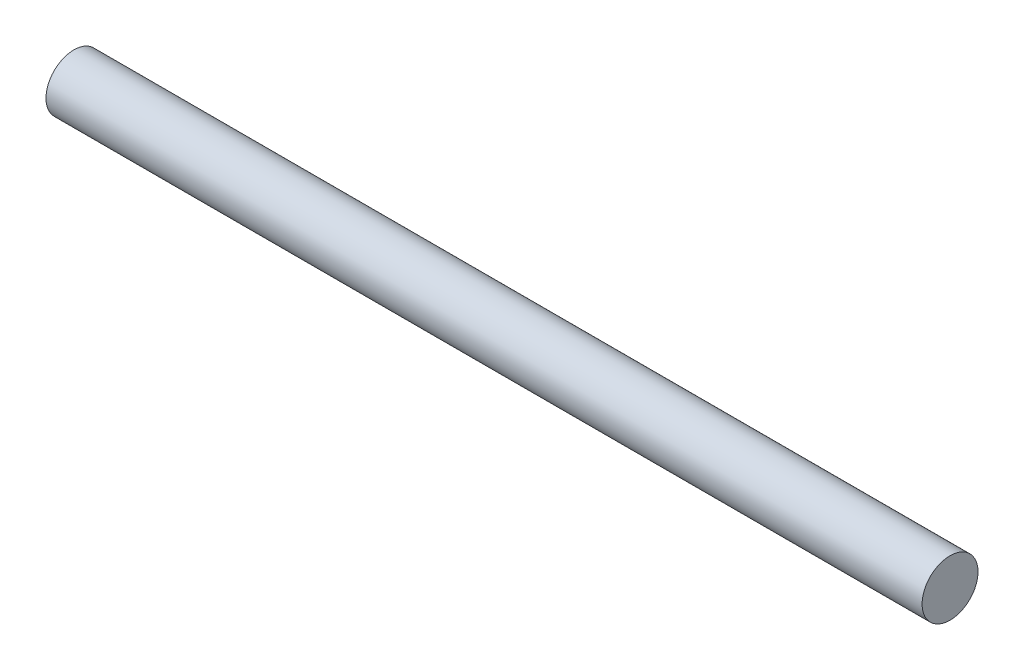
ISO-10303-21;
HEADER;
FILE_DESCRIPTION(('STEP AP214'),'2;1');
FILE_NAME('part.step','',(''),(''),'','','');
FILE_SCHEMA(('AUTOMOTIVE_DESIGN { 1 0 10303 214 1 1 1 1 }'));
ENDSEC;
DATA;
#1=APPLICATION_CONTEXT('core data for automotive mechanical design processes');
#2=APPLICATION_PROTOCOL_DEFINITION('international standard','automotive_design',2000,#1);
#3=PRODUCT_CONTEXT('',#1,'mechanical');
#4=PRODUCT('Part','Part','',(#3));
#5=PRODUCT_RELATED_PRODUCT_CATEGORY('part','',(#4));
#6=PRODUCT_DEFINITION_FORMATION('','',#4);
#7=PRODUCT_DEFINITION_CONTEXT('part definition',#1,'design');
#8=PRODUCT_DEFINITION('design','',#6,#7);
#9=PRODUCT_DEFINITION_SHAPE('','',#8);
#10=(LENGTH_UNIT() NAMED_UNIT(*) SI_UNIT(.MILLI.,.METRE.));
#11=(NAMED_UNIT(*) PLANE_ANGLE_UNIT() SI_UNIT($,.RADIAN.));
#12=(NAMED_UNIT(*) SI_UNIT($,.STERADIAN.) SOLID_ANGLE_UNIT());
#13=UNCERTAINTY_MEASURE_WITH_UNIT(LENGTH_MEASURE(1.E-05),#10,'distance_accuracy_value','');
#14=(GEOMETRIC_REPRESENTATION_CONTEXT(3) GLOBAL_UNCERTAINTY_ASSIGNED_CONTEXT((#13)) GLOBAL_UNIT_ASSIGNED_CONTEXT((#10,
#11,#12)) REPRESENTATION_CONTEXT('',''));
#15=CARTESIAN_POINT('',(0.,0.,0.));
#16=DIRECTION('',(0.,0.,1.));
#17=DIRECTION('',(1.,0.,0.));
#18=AXIS2_PLACEMENT_3D('',#15,#16,#17);
#19=CARTESIAN_POINT('',(47.,0.,0.));
#20=DIRECTION('',(-1.,0.,0.));
#21=DIRECTION('',(0.,0.,1.));
#22=AXIS2_PLACEMENT_3D('',#19,#20,#21);
#23=CYLINDRICAL_SURFACE('',#22,1.5);
#24=CARTESIAN_POINT('',(47.,0.,0.));
#25=DIRECTION('',(1.,0.,0.));
#26=DIRECTION('',(0.,0.,-1.));
#27=AXIS2_PLACEMENT_3D('',#24,#25,#26);
#28=CIRCLE('',#27,1.5);
#29=CARTESIAN_POINT('',(47.,0.,-1.5));
#30=VERTEX_POINT('',#29);
#31=EDGE_CURVE('E10',#30,#30,#28,.T.);
#32=ORIENTED_EDGE('',*,*,#31,.F.);
#33=EDGE_LOOP('',(#32));
#34=FACE_BOUND('',#33,.T.);
#35=CARTESIAN_POINT('',(0.,0.,0.));
#36=DIRECTION('',(1.,0.,0.));
#37=DIRECTION('',(0.,0.,-1.));
#38=AXIS2_PLACEMENT_3D('',#35,#36,#37);
#39=CIRCLE('',#38,1.5);
#40=CARTESIAN_POINT('',(0.,0.,-1.5));
#41=VERTEX_POINT('',#40);
#42=EDGE_CURVE('E34',#41,#41,#39,.T.);
#43=ORIENTED_EDGE('',*,*,#42,.T.);
#44=EDGE_LOOP('',(#43));
#45=FACE_BOUND('',#44,.T.);
#46=ADVANCED_FACE('F31',(#34,#45),#23,.T.);
#47=CARTESIAN_POINT('',(47.,0.,0.));
#48=DIRECTION('',(1.,0.,0.));
#49=DIRECTION('',(0.,0.,-1.));
#50=AXIS2_PLACEMENT_3D('',#47,#48,#49);
#51=PLANE('',#50);
#52=ORIENTED_EDGE('',*,*,#31,.T.);
#53=EDGE_LOOP('',(#52));
#54=FACE_BOUND('',#53,.T.);
#55=ADVANCED_FACE('F46',(#54),#51,.T.);
#56=CARTESIAN_POINT('',(0.,0.,0.));
#57=DIRECTION('',(1.,0.,0.));
#58=DIRECTION('',(0.,0.,-1.));
#59=AXIS2_PLACEMENT_3D('',#56,#57,#58);
#60=PLANE('',#59);
#61=ORIENTED_EDGE('',*,*,#42,.F.);
#62=EDGE_LOOP('',(#61));
#63=FACE_BOUND('',#62,.T.);
#64=ADVANCED_FACE('F44',(#63),#60,.F.);
#65=CLOSED_SHELL('',(#46,#55,#64));
#66=MANIFOLD_SOLID_BREP('B2',#65);
#67=ADVANCED_BREP_SHAPE_REPRESENTATION('',(#18,#66),#14);
#68=SHAPE_DEFINITION_REPRESENTATION(#9,#67);
ENDSEC;
END-ISO-10303-21;
